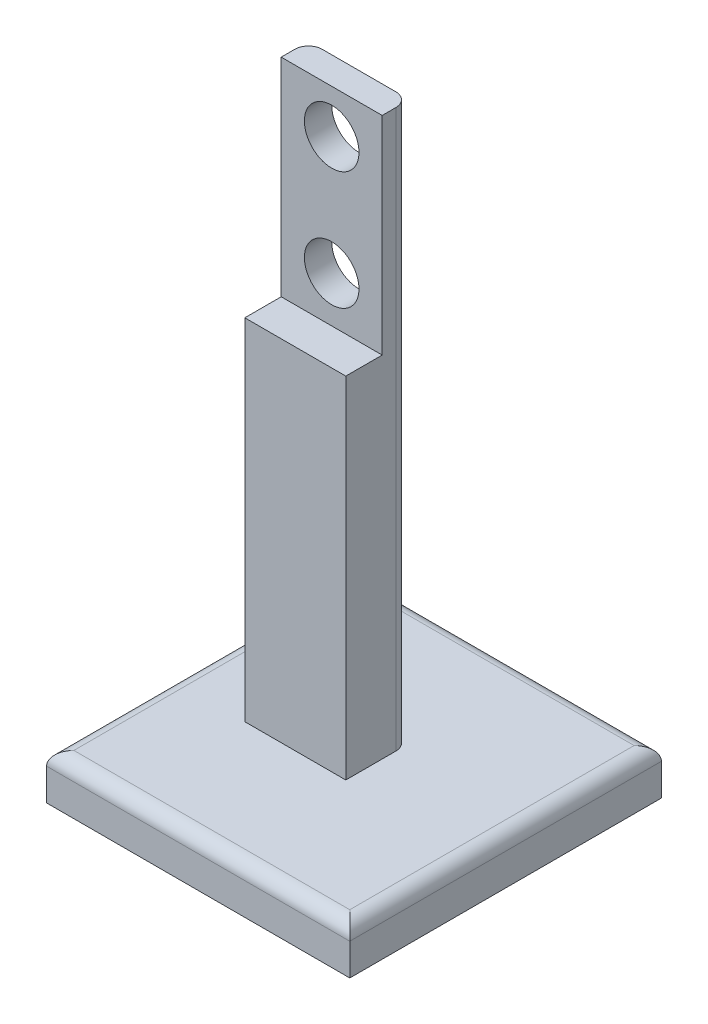
ISO-10303-21;
HEADER;
FILE_DESCRIPTION(('STEP AP214'),'2;1');
FILE_NAME('part.step','',(''),(''),'','','');
FILE_SCHEMA(('AUTOMOTIVE_DESIGN { 1 0 10303 214 1 1 1 1 }'));
ENDSEC;
DATA;
#1=APPLICATION_CONTEXT('core data for automotive mechanical design processes');
#2=APPLICATION_PROTOCOL_DEFINITION('international standard','automotive_design',2000,#1);
#3=PRODUCT_CONTEXT('',#1,'mechanical');
#4=PRODUCT('Part','Part','',(#3));
#5=PRODUCT_RELATED_PRODUCT_CATEGORY('part','',(#4));
#6=PRODUCT_DEFINITION_FORMATION('','',#4);
#7=PRODUCT_DEFINITION_CONTEXT('part definition',#1,'design');
#8=PRODUCT_DEFINITION('design','',#6,#7);
#9=PRODUCT_DEFINITION_SHAPE('','',#8);
#10=(LENGTH_UNIT() NAMED_UNIT(*) SI_UNIT(.MILLI.,.METRE.));
#11=(NAMED_UNIT(*) PLANE_ANGLE_UNIT() SI_UNIT($,.RADIAN.));
#12=(NAMED_UNIT(*) SI_UNIT($,.STERADIAN.) SOLID_ANGLE_UNIT());
#13=UNCERTAINTY_MEASURE_WITH_UNIT(LENGTH_MEASURE(1.E-05),#10,'distance_accuracy_value','');
#14=(GEOMETRIC_REPRESENTATION_CONTEXT(3) GLOBAL_UNCERTAINTY_ASSIGNED_CONTEXT((#13)) GLOBAL_UNIT_ASSIGNED_CONTEXT((#10,
#11,#12)) REPRESENTATION_CONTEXT('',''));
#15=CARTESIAN_POINT('',(0.,0.,0.));
#16=DIRECTION('',(0.,0.,1.));
#17=DIRECTION('',(1.,0.,0.));
#18=AXIS2_PLACEMENT_3D('',#15,#16,#17);
#19=CARTESIAN_POINT('',(5.54945588157807,11.4057669829908,3.));
#20=DIRECTION('',(-1.,0.,0.));
#21=DIRECTION('',(0.,-1.,0.));
#22=AXIS2_PLACEMENT_3D('',#19,#20,#21);
#23=PLANE('',#22);
#24=DIRECTION('',(0.,0.,1.));
#25=VECTOR('',#24,1.);
#26=CARTESIAN_POINT('',(5.54945588157807,-49.8558636712758,3.));
#27=LINE('',#26,#25);
#28=CARTESIAN_POINT('',(5.54945588157807,-49.8558636712758,1.5));
#29=VERTEX_POINT('',#28);
#30=CARTESIAN_POINT('',(5.54945588157807,-49.8558636712758,7.));
#31=VERTEX_POINT('',#30);
#32=EDGE_CURVE('E193',#29,#31,#27,.T.);
#33=ORIENTED_EDGE('',*,*,#32,.F.);
#34=DIRECTION('',(0.,1.,0.));
#35=VECTOR('',#34,1.);
#36=CARTESIAN_POINT('',(5.54945588157807,11.4057669829908,1.5));
#37=LINE('',#36,#35);
#38=CARTESIAN_POINT('',(5.54945588157807,11.4057669829908,1.5));
#39=VERTEX_POINT('',#38);
#40=EDGE_CURVE('E289',#29,#39,#37,.T.);
#41=ORIENTED_EDGE('',*,*,#40,.T.);
#42=DIRECTION('',(0.,0.,-1.));
#43=VECTOR('',#42,1.);
#44=CARTESIAN_POINT('',(5.54945588157807,11.4057669829908,3.));
#45=LINE('',#44,#43);
#46=CARTESIAN_POINT('',(5.54945588157807,11.4057669829908,3.));
#47=VERTEX_POINT('',#46);
#48=EDGE_CURVE('E256',#47,#39,#45,.T.);
#49=ORIENTED_EDGE('',*,*,#48,.F.);
#50=DIRECTION('',(0.,1.,0.));
#51=VECTOR('',#50,1.);
#52=CARTESIAN_POINT('',(5.54945588157807,11.4057669829908,3.));
#53=LINE('',#52,#51);
#54=CARTESIAN_POINT('',(5.54945588157807,-11.4057669829908,3.));
#55=VERTEX_POINT('',#54);
#56=EDGE_CURVE('E234',#55,#47,#53,.T.);
#57=ORIENTED_EDGE('',*,*,#56,.F.);
#58=DIRECTION('',(0.,0.,-1.));
#59=VECTOR('',#58,1.);
#60=CARTESIAN_POINT('',(5.54945588157807,-11.4057669829908,7.));
#61=LINE('',#60,#59);
#62=CARTESIAN_POINT('',(5.54945588157807,-11.4057669829908,7.));
#63=VERTEX_POINT('',#62);
#64=EDGE_CURVE('E211',#63,#55,#61,.T.);
#65=ORIENTED_EDGE('',*,*,#64,.F.);
#66=DIRECTION('',(0.,-1.,0.));
#67=VECTOR('',#66,1.);
#68=CARTESIAN_POINT('',(5.54945588157807,-11.4057669829908,7.));
#69=LINE('',#68,#67);
#70=EDGE_CURVE('E199',#63,#31,#69,.T.);
#71=ORIENTED_EDGE('',*,*,#70,.T.);
#72=EDGE_LOOP('',(#33,#41,#49,#57,#65,#71));
#73=FACE_BOUND('',#72,.T.);
#74=ADVANCED_FACE('F39',(#73),#23,.F.);
#75=CARTESIAN_POINT('',(-5.54945588157807,11.4057669829908,3.));
#76=DIRECTION('',(1.,0.,0.));
#77=DIRECTION('',(0.,1.,0.));
#78=AXIS2_PLACEMENT_3D('',#75,#76,#77);
#79=PLANE('',#78);
#80=DIRECTION('',(0.,0.,-1.));
#81=VECTOR('',#80,1.);
#82=CARTESIAN_POINT('',(-5.54945588157807,11.4057669829908,3.));
#83=LINE('',#82,#81);
#84=CARTESIAN_POINT('',(-5.54945588157807,11.4057669829908,3.));
#85=VERTEX_POINT('',#84);
#86=CARTESIAN_POINT('',(-5.54945588157807,11.4057669829908,1.5));
#87=VERTEX_POINT('',#86);
#88=EDGE_CURVE('E249',#85,#87,#83,.T.);
#89=ORIENTED_EDGE('',*,*,#88,.T.);
#90=DIRECTION('',(0.,-1.,0.));
#91=VECTOR('',#90,1.);
#92=CARTESIAN_POINT('',(-5.54945588157807,11.4057669829908,1.5));
#93=LINE('',#92,#91);
#94=CARTESIAN_POINT('',(-5.54945588157806,-49.8558636712758,1.5));
#95=VERTEX_POINT('',#94);
#96=EDGE_CURVE('E313',#87,#95,#93,.T.);
#97=ORIENTED_EDGE('',*,*,#96,.T.);
#98=DIRECTION('',(0.,0.,-1.));
#99=VECTOR('',#98,1.);
#100=CARTESIAN_POINT('',(-5.54945588157806,-49.8558636712758,3.));
#101=LINE('',#100,#99);
#102=CARTESIAN_POINT('',(-5.54945588157807,-49.8558636712758,7.));
#103=VERTEX_POINT('',#102);
#104=EDGE_CURVE('E184',#103,#95,#101,.T.);
#105=ORIENTED_EDGE('',*,*,#104,.F.);
#106=DIRECTION('',(0.,1.,0.));
#107=VECTOR('',#106,1.);
#108=CARTESIAN_POINT('',(-5.54945588157807,-11.4057669829908,7.));
#109=LINE('',#108,#107);
#110=CARTESIAN_POINT('',(-5.54945588157807,-11.4057669829908,7.));
#111=VERTEX_POINT('',#110);
#112=EDGE_CURVE('E203',#103,#111,#109,.T.);
#113=ORIENTED_EDGE('',*,*,#112,.T.);
#114=DIRECTION('',(0.,0.,-1.));
#115=VECTOR('',#114,1.);
#116=CARTESIAN_POINT('',(-5.54945588157807,-11.4057669829908,7.));
#117=LINE('',#116,#115);
#118=CARTESIAN_POINT('',(-5.54945588157807,-11.4057669829908,3.));
#119=VERTEX_POINT('',#118);
#120=EDGE_CURVE('E210',#111,#119,#117,.T.);
#121=ORIENTED_EDGE('',*,*,#120,.T.);
#122=DIRECTION('',(0.,-1.,0.));
#123=VECTOR('',#122,1.);
#124=CARTESIAN_POINT('',(-5.54945588157807,11.4057669829908,3.));
#125=LINE('',#124,#123);
#126=EDGE_CURVE('E241',#85,#119,#125,.T.);
#127=ORIENTED_EDGE('',*,*,#126,.F.);
#128=EDGE_LOOP('',(#89,#97,#105,#113,#121,#127));
#129=FACE_BOUND('',#128,.T.);
#130=ADVANCED_FACE('F334',(#129),#79,.F.);
#131=CARTESIAN_POINT('',(0.,0.,0.));
#132=DIRECTION('',(0.,0.,1.));
#133=DIRECTION('',(1.,0.,0.));
#134=AXIS2_PLACEMENT_3D('',#131,#132,#133);
#135=PLANE('',#134);
#136=CARTESIAN_POINT('',(0.,6.60978630773606,0.));
#137=DIRECTION('',(0.,0.,-1.));
#138=DIRECTION('',(-1.,0.,0.));
#139=AXIS2_PLACEMENT_3D('',#136,#137,#138);
#140=CIRCLE('',#139,3.);
#141=CARTESIAN_POINT('',(-3.,6.60978630773606,0.));
#142=VERTEX_POINT('',#141);
#143=EDGE_CURVE('E222',#142,#142,#140,.T.);
#144=ORIENTED_EDGE('',*,*,#143,.F.);
#145=EDGE_LOOP('',(#144));
#146=FACE_BOUND('',#145,.T.);
#147=CARTESIAN_POINT('',(0.,-6.39021369226394,0.));
#148=DIRECTION('',(0.,0.,-1.));
#149=DIRECTION('',(-1.,0.,0.));
#150=AXIS2_PLACEMENT_3D('',#147,#148,#149);
#151=CIRCLE('',#150,3.);
#152=CARTESIAN_POINT('',(-3.,-6.39021369226394,0.));
#153=VERTEX_POINT('',#152);
#154=EDGE_CURVE('E214',#153,#153,#151,.T.);
#155=ORIENTED_EDGE('',*,*,#154,.F.);
#156=EDGE_LOOP('',(#155));
#157=FACE_BOUND('',#156,.T.);
#158=DIRECTION('',(-1.,0.,0.));
#159=VECTOR('',#158,1.);
#160=CARTESIAN_POINT('',(-5.54945588157807,11.4057669829908,0.));
#161=LINE('',#160,#159);
#162=CARTESIAN_POINT('',(4.04945588157807,11.4057669829908,0.));
#163=VERTEX_POINT('',#162);
#164=CARTESIAN_POINT('',(-4.04945588157807,11.4057669829908,0.));
#165=VERTEX_POINT('',#164);
#166=EDGE_CURVE('E230',#163,#165,#161,.T.);
#167=ORIENTED_EDGE('',*,*,#166,.F.);
#168=DIRECTION('',(0.,1.,0.));
#169=VECTOR('',#168,1.);
#170=CARTESIAN_POINT('',(4.04945588157807,0.,0.));
#171=LINE('',#170,#169);
#172=CARTESIAN_POINT('',(4.04945588157807,-49.8558636712758,0.));
#173=VERTEX_POINT('',#172);
#174=EDGE_CURVE('E61',#163,#173,#171,.F.);
#175=ORIENTED_EDGE('',*,*,#174,.T.);
#176=DIRECTION('',(1.,0.,0.));
#177=VECTOR('',#176,1.);
#178=CARTESIAN_POINT('',(0.,-49.8558636712758,0.));
#179=LINE('',#178,#177);
#180=CARTESIAN_POINT('',(-4.04945588157806,-49.8558636712758,0.));
#181=VERTEX_POINT('',#180);
#182=EDGE_CURVE('E196',#181,#173,#179,.T.);
#183=ORIENTED_EDGE('',*,*,#182,.F.);
#184=DIRECTION('',(0.,-1.,0.));
#185=VECTOR('',#184,1.);
#186=CARTESIAN_POINT('',(-4.04945588157807,0.,0.));
#187=LINE('',#186,#185);
#188=EDGE_CURVE('E308',#181,#165,#187,.F.);
#189=ORIENTED_EDGE('',*,*,#188,.T.);
#190=EDGE_LOOP('',(#167,#175,#183,#189));
#191=FACE_BOUND('',#190,.T.);
#192=ADVANCED_FACE('F330',(#146,#157,#191),#135,.F.);
#193=CARTESIAN_POINT('',(0.,0.,7.));
#194=DIRECTION('',(0.,0.,-1.));
#195=DIRECTION('',(-1.,0.,0.));
#196=AXIS2_PLACEMENT_3D('',#193,#194,#195);
#197=PLANE('',#196);
#198=DIRECTION('',(-1.,0.,0.));
#199=VECTOR('',#198,1.);
#200=CARTESIAN_POINT('',(0.,-49.8558636712758,7.));
#201=LINE('',#200,#199);
#202=EDGE_CURVE('E260',#31,#103,#201,.T.);
#203=ORIENTED_EDGE('',*,*,#202,.F.);
#204=ORIENTED_EDGE('',*,*,#70,.F.);
#205=DIRECTION('',(1.,0.,0.));
#206=VECTOR('',#205,1.);
#207=CARTESIAN_POINT('',(5.54945588157807,-11.4057669829908,7.));
#208=LINE('',#207,#206);
#209=EDGE_CURVE('E206',#111,#63,#208,.T.);
#210=ORIENTED_EDGE('',*,*,#209,.F.);
#211=ORIENTED_EDGE('',*,*,#112,.F.);
#212=EDGE_LOOP('',(#203,#204,#210,#211));
#213=FACE_BOUND('',#212,.T.);
#214=ADVANCED_FACE('F343',(#213),#197,.F.);
#215=CARTESIAN_POINT('',(-5.54945588157807,11.4057669829908,3.));
#216=DIRECTION('',(0.,-1.,0.));
#217=DIRECTION('',(1.,0.,0.));
#218=AXIS2_PLACEMENT_3D('',#215,#216,#217);
#219=PLANE('',#218);
#220=ORIENTED_EDGE('',*,*,#48,.T.);
#221=CARTESIAN_POINT('',(4.04945588157807,11.4057669829908,1.5));
#222=DIRECTION('',(0.,-1.,0.));
#223=DIRECTION('',(1.,0.,0.));
#224=AXIS2_PLACEMENT_3D('',#221,#222,#223);
#225=CIRCLE('',#224,1.5);
#226=EDGE_CURVE('E305',#39,#163,#225,.F.);
#227=ORIENTED_EDGE('',*,*,#226,.T.);
#228=ORIENTED_EDGE('',*,*,#166,.T.);
#229=CARTESIAN_POINT('',(-4.04945588157807,11.4057669829908,1.5));
#230=DIRECTION('',(0.,-1.,0.));
#231=DIRECTION('',(1.,0.,0.));
#232=AXIS2_PLACEMENT_3D('',#229,#230,#231);
#233=CIRCLE('',#232,1.5);
#234=EDGE_CURVE('E302',#165,#87,#233,.F.);
#235=ORIENTED_EDGE('',*,*,#234,.T.);
#236=ORIENTED_EDGE('',*,*,#88,.F.);
#237=DIRECTION('',(-1.,0.,0.));
#238=VECTOR('',#237,1.);
#239=CARTESIAN_POINT('',(-5.54945588157807,11.4057669829908,3.));
#240=LINE('',#239,#238);
#241=EDGE_CURVE('E238',#47,#85,#240,.T.);
#242=ORIENTED_EDGE('',*,*,#241,.F.);
#243=EDGE_LOOP('',(#220,#227,#228,#235,#236,#242));
#244=FACE_BOUND('',#243,.T.);
#245=ADVANCED_FACE('F328',(#244),#219,.F.);
#246=CARTESIAN_POINT('',(0.,0.,3.));
#247=DIRECTION('',(0.,0.,1.));
#248=DIRECTION('',(1.,0.,0.));
#249=AXIS2_PLACEMENT_3D('',#246,#247,#248);
#250=PLANE('',#249);
#251=CARTESIAN_POINT('',(0.,-6.39021369226394,3.));
#252=DIRECTION('',(0.,0.,-1.));
#253=DIRECTION('',(-1.,0.,0.));
#254=AXIS2_PLACEMENT_3D('',#251,#252,#253);
#255=CIRCLE('',#254,3.);
#256=CARTESIAN_POINT('',(-3.,-6.39021369226394,3.));
#257=VERTEX_POINT('',#256);
#258=EDGE_CURVE('E218',#257,#257,#255,.T.);
#259=ORIENTED_EDGE('',*,*,#258,.T.);
#260=EDGE_LOOP('',(#259));
#261=FACE_BOUND('',#260,.T.);
#262=CARTESIAN_POINT('',(0.,6.60978630773606,3.));
#263=DIRECTION('',(0.,0.,-1.));
#264=DIRECTION('',(-1.,0.,0.));
#265=AXIS2_PLACEMENT_3D('',#262,#263,#264);
#266=CIRCLE('',#265,3.);
#267=CARTESIAN_POINT('',(-3.,6.60978630773606,3.));
#268=VERTEX_POINT('',#267);
#269=EDGE_CURVE('E226',#268,#268,#266,.T.);
#270=ORIENTED_EDGE('',*,*,#269,.T.);
#271=EDGE_LOOP('',(#270));
#272=FACE_BOUND('',#271,.T.);
#273=ORIENTED_EDGE('',*,*,#56,.T.);
#274=ORIENTED_EDGE('',*,*,#241,.T.);
#275=ORIENTED_EDGE('',*,*,#126,.T.);
#276=DIRECTION('',(1.,0.,0.));
#277=VECTOR('',#276,1.);
#278=CARTESIAN_POINT('',(-5.54945588157807,-11.4057669829908,3.));
#279=LINE('',#278,#277);
#280=EDGE_CURVE('E245',#119,#55,#279,.T.);
#281=ORIENTED_EDGE('',*,*,#280,.T.);
#282=EDGE_LOOP('',(#273,#274,#275,#281));
#283=FACE_BOUND('',#282,.T.);
#284=ADVANCED_FACE('F338',(#261,#272,#283),#250,.T.);
#285=CARTESIAN_POINT('',(0.,6.60978630773606,3.));
#286=DIRECTION('',(0.,0.,-1.));
#287=DIRECTION('',(-1.,0.,0.));
#288=AXIS2_PLACEMENT_3D('',#285,#286,#287);
#289=CYLINDRICAL_SURFACE('',#288,3.);
#290=ORIENTED_EDGE('',*,*,#269,.F.);
#291=EDGE_LOOP('',(#290));
#292=FACE_BOUND('',#291,.T.);
#293=ORIENTED_EDGE('',*,*,#143,.T.);
#294=EDGE_LOOP('',(#293));
#295=FACE_BOUND('',#294,.T.);
#296=ADVANCED_FACE('F354',(#292,#295),#289,.F.);
#297=CARTESIAN_POINT('',(0.,-6.39021369226394,3.));
#298=DIRECTION('',(0.,0.,-1.));
#299=DIRECTION('',(-1.,0.,0.));
#300=AXIS2_PLACEMENT_3D('',#297,#298,#299);
#301=CYLINDRICAL_SURFACE('',#300,3.);
#302=ORIENTED_EDGE('',*,*,#258,.F.);
#303=EDGE_LOOP('',(#302));
#304=FACE_BOUND('',#303,.T.);
#305=ORIENTED_EDGE('',*,*,#154,.T.);
#306=EDGE_LOOP('',(#305));
#307=FACE_BOUND('',#306,.T.);
#308=ADVANCED_FACE('F346',(#304,#307),#301,.F.);
#309=CARTESIAN_POINT('',(5.54945588157807,-11.4057669829908,7.));
#310=DIRECTION('',(0.,1.,0.));
#311=DIRECTION('',(0.,0.,1.));
#312=AXIS2_PLACEMENT_3D('',#309,#310,#311);
#313=PLANE('',#312);
#314=ORIENTED_EDGE('',*,*,#280,.F.);
#315=ORIENTED_EDGE('',*,*,#120,.F.);
#316=ORIENTED_EDGE('',*,*,#209,.T.);
#317=ORIENTED_EDGE('',*,*,#64,.T.);
#318=EDGE_LOOP('',(#314,#315,#316,#317));
#319=FACE_BOUND('',#318,.T.);
#320=ADVANCED_FACE('F344',(#319),#313,.T.);
#321=CARTESIAN_POINT('',(0.,-49.8558636712758,0.));
#322=DIRECTION('',(0.,-1.,0.));
#323=DIRECTION('',(0.,0.,-1.));
#324=AXIS2_PLACEMENT_3D('',#321,#322,#323);
#325=PLANE('',#324);
#326=DIRECTION('',(0.,0.,-1.));
#327=VECTOR('',#326,1.);
#328=CARTESIAN_POINT('',(-12.2113061657614,-49.8558636712758,20.6277710784093));
#329=LINE('',#328,#327);
#330=CARTESIAN_POINT('',(-12.2113061657614,-49.8558636712758,-12.1275852222525));
#331=VERTEX_POINT('',#330);
#332=CARTESIAN_POINT('',(-12.2113061657614,-49.8558636712758,19.1277710784093));
#333=VERTEX_POINT('',#332);
#334=EDGE_CURVE('E274',#331,#333,#329,.F.);
#335=ORIENTED_EDGE('',*,*,#334,.T.);
#336=DIRECTION('',(-1.,0.,0.));
#337=VECTOR('',#336,1.);
#338=CARTESIAN_POINT('',(19.6148427045273,-49.8558636712758,19.1277710784093));
#339=LINE('',#338,#337);
#340=CARTESIAN_POINT('',(18.1148427045273,-49.8558636712758,19.1277710784093));
#341=VERTEX_POINT('',#340);
#342=EDGE_CURVE('E277',#333,#341,#339,.F.);
#343=ORIENTED_EDGE('',*,*,#342,.T.);
#344=DIRECTION('',(0.,0.,1.));
#345=VECTOR('',#344,1.);
#346=CARTESIAN_POINT('',(18.1148427045273,-49.8558636712758,-13.6275852222525));
#347=LINE('',#346,#345);
#348=CARTESIAN_POINT('',(18.1148427045273,-49.8558636712758,-12.1275852222525));
#349=VERTEX_POINT('',#348);
#350=EDGE_CURVE('E268',#341,#349,#347,.F.);
#351=ORIENTED_EDGE('',*,*,#350,.T.);
#352=DIRECTION('',(1.,0.,0.));
#353=VECTOR('',#352,1.);
#354=CARTESIAN_POINT('',(-13.7113061657614,-49.8558636712758,-12.1275852222525));
#355=LINE('',#354,#353);
#356=EDGE_CURVE('E271',#349,#331,#355,.F.);
#357=ORIENTED_EDGE('',*,*,#356,.T.);
#358=EDGE_LOOP('',(#335,#343,#351,#357));
#359=FACE_BOUND('',#358,.T.);
#360=ORIENTED_EDGE('',*,*,#104,.T.);
#361=CARTESIAN_POINT('',(-4.04945588157806,-49.8558636712758,1.5));
#362=DIRECTION('',(0.,-1.,0.));
#363=DIRECTION('',(0.,0.,-1.));
#364=AXIS2_PLACEMENT_3D('',#361,#362,#363);
#365=CIRCLE('',#364,1.5);
#366=EDGE_CURVE('E11',#95,#181,#365,.T.);
#367=ORIENTED_EDGE('',*,*,#366,.T.);
#368=ORIENTED_EDGE('',*,*,#182,.T.);
#369=CARTESIAN_POINT('',(4.04945588157807,-49.8558636712758,1.5));
#370=DIRECTION('',(0.,-1.,0.));
#371=DIRECTION('',(0.,0.,-1.));
#372=AXIS2_PLACEMENT_3D('',#369,#370,#371);
#373=CIRCLE('',#372,1.5);
#374=EDGE_CURVE('E48',#173,#29,#373,.T.);
#375=ORIENTED_EDGE('',*,*,#374,.T.);
#376=ORIENTED_EDGE('',*,*,#32,.T.);
#377=ORIENTED_EDGE('',*,*,#202,.T.);
#378=EDGE_LOOP('',(#360,#367,#368,#375,#376,#377));
#379=FACE_BOUND('',#378,.T.);
#380=ADVANCED_FACE('F319',(#359,#379),#325,.F.);
#381=CARTESIAN_POINT('',(-13.7113061657614,-49.8558636712758,-13.6275852222525));
#382=DIRECTION('',(-1.,0.,0.));
#383=DIRECTION('',(0.,0.,1.));
#384=AXIS2_PLACEMENT_3D('',#381,#382,#383);
#385=PLANE('',#384);
#386=DIRECTION('',(0.,-1.,0.));
#387=VECTOR('',#386,1.);
#388=CARTESIAN_POINT('',(-13.7113061657614,-49.8558636712758,20.6277710784093));
#389=LINE('',#388,#387);
#390=CARTESIAN_POINT('',(-13.7113061657614,-51.3558636712758,20.6277710784093));
#391=VERTEX_POINT('',#390);
#392=CARTESIAN_POINT('',(-13.7113061657614,-54.8558636712758,20.6277710784093));
#393=VERTEX_POINT('',#392);
#394=EDGE_CURVE('E181',#391,#393,#389,.T.);
#395=ORIENTED_EDGE('',*,*,#394,.F.);
#396=DIRECTION('',(0.,0.,-1.));
#397=VECTOR('',#396,1.);
#398=CARTESIAN_POINT('',(-13.7113061657614,-51.3558636712758,-13.6275852222525));
#399=LINE('',#398,#397);
#400=CARTESIAN_POINT('',(-13.7113061657614,-51.3558636712758,-13.6275852222525));
#401=VERTEX_POINT('',#400);
#402=EDGE_CURVE('E150',#391,#401,#399,.T.);
#403=ORIENTED_EDGE('',*,*,#402,.T.);
#404=DIRECTION('',(0.,-1.,0.));
#405=VECTOR('',#404,1.);
#406=CARTESIAN_POINT('',(-13.7113061657614,-49.8558636712758,-13.6275852222525));
#407=LINE('',#406,#405);
#408=CARTESIAN_POINT('',(-13.7113061657614,-54.8558636712758,-13.6275852222525));
#409=VERTEX_POINT('',#408);
#410=EDGE_CURVE('E142',#401,#409,#407,.T.);
#411=ORIENTED_EDGE('',*,*,#410,.T.);
#412=DIRECTION('',(0.,0.,-1.));
#413=VECTOR('',#412,1.);
#414=CARTESIAN_POINT('',(-13.7113061657614,-54.8558636712758,-13.6275852222525));
#415=LINE('',#414,#413);
#416=EDGE_CURVE('E147',#393,#409,#415,.T.);
#417=ORIENTED_EDGE('',*,*,#416,.F.);
#418=EDGE_LOOP('',(#395,#403,#411,#417));
#419=FACE_BOUND('',#418,.T.);
#420=ADVANCED_FACE('F145',(#419),#385,.T.);
#421=CARTESIAN_POINT('',(19.6148427045273,-49.8558636712758,20.6277710784093));
#422=DIRECTION('',(0.,0.,1.));
#423=DIRECTION('',(1.,0.,0.));
#424=AXIS2_PLACEMENT_3D('',#421,#422,#423);
#425=PLANE('',#424);
#426=DIRECTION('',(0.,-1.,0.));
#427=VECTOR('',#426,1.);
#428=CARTESIAN_POINT('',(19.6148427045273,-49.8558636712758,20.6277710784093));
#429=LINE('',#428,#427);
#430=CARTESIAN_POINT('',(19.6148427045273,-51.3558636712758,20.6277710784093));
#431=VERTEX_POINT('',#430);
#432=CARTESIAN_POINT('',(19.6148427045273,-54.8558636712758,20.6277710784093));
#433=VERTEX_POINT('',#432);
#434=EDGE_CURVE('E185',#431,#433,#429,.T.);
#435=ORIENTED_EDGE('',*,*,#434,.F.);
#436=DIRECTION('',(-1.,0.,0.));
#437=VECTOR('',#436,1.);
#438=CARTESIAN_POINT('',(-13.7113061657614,-51.3558636712758,20.6277710784093));
#439=LINE('',#438,#437);
#440=EDGE_CURVE('E264',#431,#391,#439,.T.);
#441=ORIENTED_EDGE('',*,*,#440,.T.);
#442=ORIENTED_EDGE('',*,*,#394,.T.);
#443=DIRECTION('',(-1.,0.,0.));
#444=VECTOR('',#443,1.);
#445=CARTESIAN_POINT('',(19.6148427045273,-54.8558636712758,20.6277710784093));
#446=LINE('',#445,#444);
#447=EDGE_CURVE('E155',#433,#393,#446,.T.);
#448=ORIENTED_EDGE('',*,*,#447,.F.);
#449=EDGE_LOOP('',(#435,#441,#442,#448));
#450=FACE_BOUND('',#449,.T.);
#451=ADVANCED_FACE('F476',(#450),#425,.T.);
#452=CARTESIAN_POINT('',(19.6148427045273,-49.8558636712758,-13.6275852222525));
#453=DIRECTION('',(1.,0.,0.));
#454=DIRECTION('',(0.,0.,-1.));
#455=AXIS2_PLACEMENT_3D('',#452,#453,#454);
#456=PLANE('',#455);
#457=DIRECTION('',(0.,-1.,0.));
#458=VECTOR('',#457,1.);
#459=CARTESIAN_POINT('',(19.6148427045273,-49.8558636712758,-13.6275852222525));
#460=LINE('',#459,#458);
#461=CARTESIAN_POINT('',(19.6148427045273,-51.3558636712758,-13.6275852222525));
#462=VERTEX_POINT('',#461);
#463=CARTESIAN_POINT('',(19.6148427045273,-54.8558636712758,-13.6275852222525));
#464=VERTEX_POINT('',#463);
#465=EDGE_CURVE('E154',#462,#464,#460,.T.);
#466=ORIENTED_EDGE('',*,*,#465,.F.);
#467=DIRECTION('',(0.,0.,1.));
#468=VECTOR('',#467,1.);
#469=CARTESIAN_POINT('',(19.6148427045273,-51.3558636712758,20.6277710784093));
#470=LINE('',#469,#468);
#471=EDGE_CURVE('E286',#462,#431,#470,.T.);
#472=ORIENTED_EDGE('',*,*,#471,.T.);
#473=ORIENTED_EDGE('',*,*,#434,.T.);
#474=DIRECTION('',(0.,0.,1.));
#475=VECTOR('',#474,1.);
#476=CARTESIAN_POINT('',(19.6148427045273,-54.8558636712758,-13.6275852222525));
#477=LINE('',#476,#475);
#478=EDGE_CURVE('E165',#464,#433,#477,.T.);
#479=ORIENTED_EDGE('',*,*,#478,.F.);
#480=EDGE_LOOP('',(#466,#472,#473,#479));
#481=FACE_BOUND('',#480,.T.);
#482=ADVANCED_FACE('F467',(#481),#456,.T.);
#483=CARTESIAN_POINT('',(19.6148427045273,-49.8558636712758,-13.6275852222525));
#484=DIRECTION('',(0.,0.,-1.));
#485=DIRECTION('',(-1.,0.,0.));
#486=AXIS2_PLACEMENT_3D('',#483,#484,#485);
#487=PLANE('',#486);
#488=ORIENTED_EDGE('',*,*,#410,.F.);
#489=DIRECTION('',(1.,0.,0.));
#490=VECTOR('',#489,1.);
#491=CARTESIAN_POINT('',(19.6148427045273,-51.3558636712758,-13.6275852222525));
#492=LINE('',#491,#490);
#493=EDGE_CURVE('E283',#401,#462,#492,.T.);
#494=ORIENTED_EDGE('',*,*,#493,.T.);
#495=ORIENTED_EDGE('',*,*,#465,.T.);
#496=DIRECTION('',(1.,0.,0.));
#497=VECTOR('',#496,1.);
#498=CARTESIAN_POINT('',(19.6148427045273,-54.8558636712758,-13.6275852222525));
#499=LINE('',#498,#497);
#500=EDGE_CURVE('E158',#409,#464,#499,.T.);
#501=ORIENTED_EDGE('',*,*,#500,.F.);
#502=EDGE_LOOP('',(#488,#494,#495,#501));
#503=FACE_BOUND('',#502,.T.);
#504=ADVANCED_FACE('F159',(#503),#487,.T.);
#505=CARTESIAN_POINT('',(5.54945588157807,-54.8558636712758,7.));
#506=DIRECTION('',(0.,-1.,0.));
#507=DIRECTION('',(0.,0.,-1.));
#508=AXIS2_PLACEMENT_3D('',#505,#506,#507);
#509=PLANE('',#508);
#510=ORIENTED_EDGE('',*,*,#416,.T.);
#511=ORIENTED_EDGE('',*,*,#500,.T.);
#512=ORIENTED_EDGE('',*,*,#478,.T.);
#513=ORIENTED_EDGE('',*,*,#447,.T.);
#514=EDGE_LOOP('',(#510,#511,#512,#513));
#515=FACE_BOUND('',#514,.T.);
#516=ADVANCED_FACE('F167',(#515),#509,.T.);
#517=CARTESIAN_POINT('',(19.6148427045273,-51.3558636712758,-12.1275852222525));
#518=DIRECTION('',(-1.,0.,0.));
#519=DIRECTION('',(0.,0.,1.));
#520=AXIS2_PLACEMENT_3D('',#517,#518,#519);
#521=CYLINDRICAL_SURFACE('',#520,1.5);
#522=CARTESIAN_POINT('',(-12.2113061657614,-51.3558636712758,-12.1275852222525));
#523=DIRECTION('',(-0.707106781186548,0.,0.707106781186547));
#524=DIRECTION('',(-0.707106781186547,0.,-0.707106781186548));
#525=AXIS2_PLACEMENT_3D('',#522,#523,#524);
#526=ELLIPSE('',#525,2.12132034355964,1.5);
#527=EDGE_CURVE('E174',#331,#401,#526,.T.);
#528=ORIENTED_EDGE('',*,*,#527,.F.);
#529=ORIENTED_EDGE('',*,*,#356,.F.);
#530=CARTESIAN_POINT('',(18.1148427045273,-51.3558636712758,-12.1275852222525));
#531=DIRECTION('',(-0.707106781186547,0.,-0.707106781186547));
#532=DIRECTION('',(0.707106781186547,0.,-0.707106781186547));
#533=AXIS2_PLACEMENT_3D('',#530,#531,#532);
#534=ELLIPSE('',#533,2.12132034355964,1.5);
#535=EDGE_CURVE('E170',#462,#349,#534,.F.);
#536=ORIENTED_EDGE('',*,*,#535,.F.);
#537=ORIENTED_EDGE('',*,*,#493,.F.);
#538=EDGE_LOOP('',(#528,#529,#536,#537));
#539=FACE_BOUND('',#538,.T.);
#540=ADVANCED_FACE('F378',(#539),#521,.T.);
#541=CARTESIAN_POINT('',(18.1148427045273,-51.3558636712758,-13.6275852222525));
#542=DIRECTION('',(0.,0.,-1.));
#543=DIRECTION('',(-1.,0.,0.));
#544=AXIS2_PLACEMENT_3D('',#541,#542,#543);
#545=CYLINDRICAL_SURFACE('',#544,1.5);
#546=ORIENTED_EDGE('',*,*,#535,.T.);
#547=ORIENTED_EDGE('',*,*,#350,.F.);
#548=CARTESIAN_POINT('',(18.1148427045273,-51.3558636712758,19.1277710784093));
#549=DIRECTION('',(0.707106781186547,0.,-0.707106781186547));
#550=DIRECTION('',(-0.707106781186547,0.,-0.707106781186547));
#551=AXIS2_PLACEMENT_3D('',#548,#549,#550);
#552=ELLIPSE('',#551,2.12132034355964,1.5);
#553=EDGE_CURVE('E293',#431,#341,#552,.F.);
#554=ORIENTED_EDGE('',*,*,#553,.F.);
#555=ORIENTED_EDGE('',*,*,#471,.F.);
#556=EDGE_LOOP('',(#546,#547,#554,#555));
#557=FACE_BOUND('',#556,.T.);
#558=ADVANCED_FACE('F374',(#557),#545,.T.);
#559=CARTESIAN_POINT('',(-12.2113061657614,-51.3558636712758,-13.6275852222525));
#560=DIRECTION('',(0.,0.,1.));
#561=DIRECTION('',(1.,0.,0.));
#562=AXIS2_PLACEMENT_3D('',#559,#560,#561);
#563=CYLINDRICAL_SURFACE('',#562,1.5);
#564=ORIENTED_EDGE('',*,*,#527,.T.);
#565=ORIENTED_EDGE('',*,*,#402,.F.);
#566=CARTESIAN_POINT('',(-12.2113061657614,-51.3558636712758,19.1277710784093));
#567=DIRECTION('',(0.707106781186547,0.,0.707106781186548));
#568=DIRECTION('',(-0.707106781186548,0.,0.707106781186547));
#569=AXIS2_PLACEMENT_3D('',#566,#567,#568);
#570=ELLIPSE('',#569,2.12132034355964,1.5);
#571=EDGE_CURVE('E290',#333,#391,#570,.T.);
#572=ORIENTED_EDGE('',*,*,#571,.F.);
#573=ORIENTED_EDGE('',*,*,#334,.F.);
#574=EDGE_LOOP('',(#564,#565,#572,#573));
#575=FACE_BOUND('',#574,.T.);
#576=ADVANCED_FACE('F370',(#575),#563,.T.);
#577=CARTESIAN_POINT('',(19.6148427045273,-51.3558636712758,19.1277710784093));
#578=DIRECTION('',(1.,0.,0.));
#579=DIRECTION('',(0.,0.,-1.));
#580=AXIS2_PLACEMENT_3D('',#577,#578,#579);
#581=CYLINDRICAL_SURFACE('',#580,1.5);
#582=ORIENTED_EDGE('',*,*,#553,.T.);
#583=ORIENTED_EDGE('',*,*,#342,.F.);
#584=ORIENTED_EDGE('',*,*,#571,.T.);
#585=ORIENTED_EDGE('',*,*,#440,.F.);
#586=EDGE_LOOP('',(#582,#583,#584,#585));
#587=FACE_BOUND('',#586,.T.);
#588=ADVANCED_FACE('F367',(#587),#581,.T.);
#589=CARTESIAN_POINT('',(4.04945588157807,11.4057669829908,1.5));
#590=DIRECTION('',(0.,1.,0.));
#591=DIRECTION('',(-1.,0.,0.));
#592=AXIS2_PLACEMENT_3D('',#589,#590,#591);
#593=CYLINDRICAL_SURFACE('',#592,1.5);
#594=ORIENTED_EDGE('',*,*,#374,.F.);
#595=ORIENTED_EDGE('',*,*,#174,.F.);
#596=ORIENTED_EDGE('',*,*,#226,.F.);
#597=ORIENTED_EDGE('',*,*,#40,.F.);
#598=EDGE_LOOP('',(#594,#595,#596,#597));
#599=FACE_BOUND('',#598,.T.);
#600=ADVANCED_FACE('F326',(#599),#593,.T.);
#601=CARTESIAN_POINT('',(-4.04945588157807,11.4057669829908,1.5));
#602=DIRECTION('',(0.,-1.,0.));
#603=DIRECTION('',(1.,0.,0.));
#604=AXIS2_PLACEMENT_3D('',#601,#602,#603);
#605=CYLINDRICAL_SURFACE('',#604,1.5);
#606=ORIENTED_EDGE('',*,*,#234,.F.);
#607=ORIENTED_EDGE('',*,*,#188,.F.);
#608=ORIENTED_EDGE('',*,*,#366,.F.);
#609=ORIENTED_EDGE('',*,*,#96,.F.);
#610=EDGE_LOOP('',(#606,#607,#608,#609));
#611=FACE_BOUND('',#610,.T.);
#612=ADVANCED_FACE('F41',(#611),#605,.T.);
#613=CLOSED_SHELL('',(#74,#130,#192,#214,#245,#284,#296,#308,#320,#380,#420,#451,#482,#504,#516,
#540,#558,#576,#588,#600,#612));
#614=MANIFOLD_SOLID_BREP('B2',#613);
#615=ADVANCED_BREP_SHAPE_REPRESENTATION('',(#18,#614),#14);
#616=SHAPE_DEFINITION_REPRESENTATION(#9,#615);
ENDSEC;
END-ISO-10303-21;
